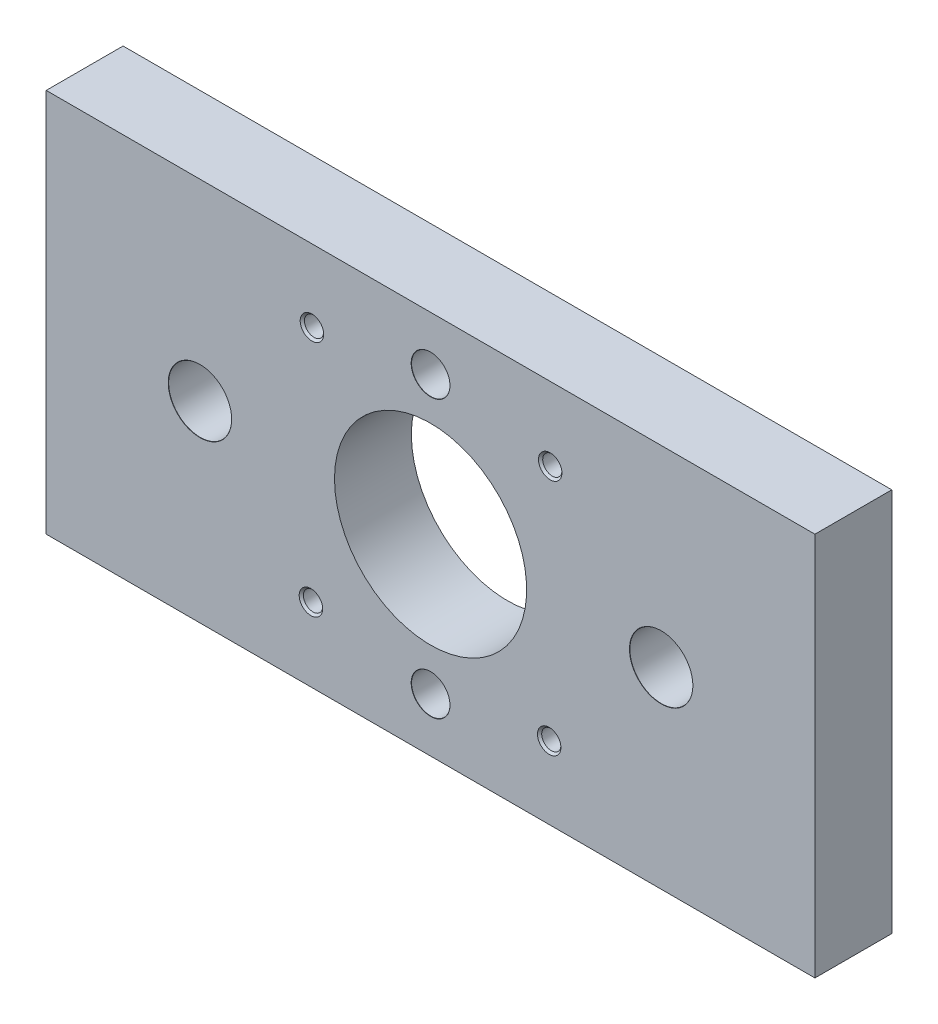
ISO-10303-21;
HEADER;
FILE_DESCRIPTION(('STEP AP214'),'2;1');
FILE_NAME('part.step','',(''),(''),'','','');
FILE_SCHEMA(('AUTOMOTIVE_DESIGN { 1 0 10303 214 1 1 1 1 }'));
ENDSEC;
DATA;
#1=APPLICATION_CONTEXT('core data for automotive mechanical design processes');
#2=APPLICATION_PROTOCOL_DEFINITION('international standard','automotive_design',2000,#1);
#3=PRODUCT_CONTEXT('',#1,'mechanical');
#4=PRODUCT('Part','Part','',(#3));
#5=PRODUCT_RELATED_PRODUCT_CATEGORY('part','',(#4));
#6=PRODUCT_DEFINITION_FORMATION('','',#4);
#7=PRODUCT_DEFINITION_CONTEXT('part definition',#1,'design');
#8=PRODUCT_DEFINITION('design','',#6,#7);
#9=PRODUCT_DEFINITION_SHAPE('','',#8);
#10=(LENGTH_UNIT() NAMED_UNIT(*) SI_UNIT(.MILLI.,.METRE.));
#11=(NAMED_UNIT(*) PLANE_ANGLE_UNIT() SI_UNIT($,.RADIAN.));
#12=(NAMED_UNIT(*) SI_UNIT($,.STERADIAN.) SOLID_ANGLE_UNIT());
#13=UNCERTAINTY_MEASURE_WITH_UNIT(LENGTH_MEASURE(1.E-05),#10,'distance_accuracy_value','');
#14=(GEOMETRIC_REPRESENTATION_CONTEXT(3) GLOBAL_UNCERTAINTY_ASSIGNED_CONTEXT((#13)) GLOBAL_UNIT_ASSIGNED_CONTEXT((#10,
#11,#12)) REPRESENTATION_CONTEXT('',''));
#15=CARTESIAN_POINT('',(0.,0.,0.));
#16=DIRECTION('',(0.,0.,1.));
#17=DIRECTION('',(1.,0.,0.));
#18=AXIS2_PLACEMENT_3D('',#15,#16,#17);
#19=CARTESIAN_POINT('',(0.,0.,10.));
#20=DIRECTION('',(0.,0.,-1.));
#21=DIRECTION('',(-1.,0.,0.));
#22=AXIS2_PLACEMENT_3D('',#19,#20,#21);
#23=PLANE('',#22);
#24=CARTESIAN_POINT('',(0.,0.,10.));
#25=DIRECTION('',(0.,0.,-1.));
#26=DIRECTION('',(-1.,0.,0.));
#27=AXIS2_PLACEMENT_3D('',#24,#25,#26);
#28=CIRCLE('',#27,12.5);
#29=CARTESIAN_POINT('',(-12.5,0.,10.));
#30=VERTEX_POINT('',#29);
#31=EDGE_CURVE('E237',#30,#30,#28,.T.);
#32=ORIENTED_EDGE('',*,*,#31,.T.);
#33=EDGE_LOOP('',(#32));
#34=FACE_BOUND('',#33,.T.);
#35=CARTESIAN_POINT('',(15.5656920969931,15.4340282992356,10.));
#36=DIRECTION('',(0.,0.,1.));
#37=DIRECTION('',(1.,0.,0.));
#38=AXIS2_PLACEMENT_3D('',#35,#36,#37);
#39=CIRCLE('',#38,1.525);
#40=CARTESIAN_POINT('',(17.0906920969931,15.4340282992356,10.));
#41=VERTEX_POINT('',#40);
#42=EDGE_CURVE('E233',#41,#41,#39,.T.);
#43=ORIENTED_EDGE('',*,*,#42,.F.);
#44=EDGE_LOOP('',(#43));
#45=FACE_BOUND('',#44,.T.);
#46=CARTESIAN_POINT('',(15.4340282992356,-15.5656920969931,10.));
#47=DIRECTION('',(0.,0.,1.));
#48=DIRECTION('',(1.,0.,0.));
#49=AXIS2_PLACEMENT_3D('',#46,#47,#48);
#50=CIRCLE('',#49,1.525);
#51=CARTESIAN_POINT('',(16.9590282992356,-15.5656920969931,10.));
#52=VERTEX_POINT('',#51);
#53=EDGE_CURVE('E221',#52,#52,#50,.T.);
#54=ORIENTED_EDGE('',*,*,#53,.F.);
#55=EDGE_LOOP('',(#54));
#56=FACE_BOUND('',#55,.T.);
#57=CARTESIAN_POINT('',(-15.5656920969931,-15.4340282992356,10.));
#58=DIRECTION('',(0.,0.,1.));
#59=DIRECTION('',(1.,0.,0.));
#60=AXIS2_PLACEMENT_3D('',#57,#58,#59);
#61=CIRCLE('',#60,1.525);
#62=CARTESIAN_POINT('',(-14.0406920969931,-15.4340282992356,10.));
#63=VERTEX_POINT('',#62);
#64=EDGE_CURVE('E209',#63,#63,#61,.T.);
#65=ORIENTED_EDGE('',*,*,#64,.F.);
#66=EDGE_LOOP('',(#65));
#67=FACE_BOUND('',#66,.T.);
#68=CARTESIAN_POINT('',(-15.4340282992356,15.5656920969931,10.));
#69=DIRECTION('',(0.,0.,1.));
#70=DIRECTION('',(1.,0.,0.));
#71=AXIS2_PLACEMENT_3D('',#68,#69,#70);
#72=CIRCLE('',#71,1.525);
#73=CARTESIAN_POINT('',(-13.9090282992356,15.5656920969931,10.));
#74=VERTEX_POINT('',#73);
#75=EDGE_CURVE('E197',#74,#74,#72,.T.);
#76=ORIENTED_EDGE('',*,*,#75,.F.);
#77=EDGE_LOOP('',(#76));
#78=FACE_BOUND('',#77,.T.);
#79=CARTESIAN_POINT('',(-30.,0.,10.));
#80=DIRECTION('',(0.,0.,1.));
#81=DIRECTION('',(1.,0.,0.));
#82=AXIS2_PLACEMENT_3D('',#79,#80,#81);
#83=CIRCLE('',#82,4.125);
#84=CARTESIAN_POINT('',(-25.875,0.,10.));
#85=VERTEX_POINT('',#84);
#86=EDGE_CURVE('E177',#85,#85,#83,.T.);
#87=ORIENTED_EDGE('',*,*,#86,.F.);
#88=EDGE_LOOP('',(#87));
#89=FACE_BOUND('',#88,.T.);
#90=CARTESIAN_POINT('',(30.,0.,10.));
#91=DIRECTION('',(0.,0.,1.));
#92=DIRECTION('',(1.,0.,0.));
#93=AXIS2_PLACEMENT_3D('',#90,#91,#92);
#94=CIRCLE('',#93,4.125);
#95=CARTESIAN_POINT('',(34.125,0.,10.));
#96=VERTEX_POINT('',#95);
#97=EDGE_CURVE('E161',#96,#96,#94,.T.);
#98=ORIENTED_EDGE('',*,*,#97,.F.);
#99=EDGE_LOOP('',(#98));
#100=FACE_BOUND('',#99,.T.);
#101=DIRECTION('',(0.,1.,0.));
#102=VECTOR('',#101,1.);
#103=CARTESIAN_POINT('',(50.,-25.,10.));
#104=LINE('',#103,#102);
#105=CARTESIAN_POINT('',(50.,-25.,10.));
#106=VERTEX_POINT('',#105);
#107=CARTESIAN_POINT('',(50.,25.,10.));
#108=VERTEX_POINT('',#107);
#109=EDGE_CURVE('E93',#106,#108,#104,.T.);
#110=ORIENTED_EDGE('',*,*,#109,.T.);
#111=DIRECTION('',(-1.,0.,0.));
#112=VECTOR('',#111,1.);
#113=CARTESIAN_POINT('',(-50.,25.,10.));
#114=LINE('',#113,#112);
#115=CARTESIAN_POINT('',(-50.,25.,10.));
#116=VERTEX_POINT('',#115);
#117=EDGE_CURVE('E88',#108,#116,#114,.T.);
#118=ORIENTED_EDGE('',*,*,#117,.T.);
#119=DIRECTION('',(0.,-1.,0.));
#120=VECTOR('',#119,1.);
#121=CARTESIAN_POINT('',(-50.,-25.,10.));
#122=LINE('',#121,#120);
#123=CARTESIAN_POINT('',(-50.,-25.,10.));
#124=VERTEX_POINT('',#123);
#125=EDGE_CURVE('E91',#116,#124,#122,.T.);
#126=ORIENTED_EDGE('',*,*,#125,.T.);
#127=DIRECTION('',(1.,0.,0.));
#128=VECTOR('',#127,1.);
#129=CARTESIAN_POINT('',(-50.,-25.,10.));
#130=LINE('',#129,#128);
#131=EDGE_CURVE('E58',#124,#106,#130,.T.);
#132=ORIENTED_EDGE('',*,*,#131,.T.);
#133=EDGE_LOOP('',(#110,#118,#126,#132));
#134=FACE_BOUND('',#133,.T.);
#135=CARTESIAN_POINT('',(0.,-18.,10.));
#136=DIRECTION('',(0.,0.,1.));
#137=DIRECTION('',(1.,0.,0.));
#138=AXIS2_PLACEMENT_3D('',#135,#136,#137);
#139=CIRCLE('',#138,2.525);
#140=CARTESIAN_POINT('',(2.525,-18.,10.));
#141=VERTEX_POINT('',#140);
#142=EDGE_CURVE('E137',#141,#141,#139,.T.);
#143=ORIENTED_EDGE('',*,*,#142,.F.);
#144=EDGE_LOOP('',(#143));
#145=FACE_BOUND('',#144,.T.);
#146=CARTESIAN_POINT('',(0.,18.,10.));
#147=DIRECTION('',(0.,0.,1.));
#148=DIRECTION('',(1.,0.,0.));
#149=AXIS2_PLACEMENT_3D('',#146,#147,#148);
#150=CIRCLE('',#149,2.525);
#151=CARTESIAN_POINT('',(2.525,18.,10.));
#152=VERTEX_POINT('',#151);
#153=EDGE_CURVE('E149',#152,#152,#150,.T.);
#154=ORIENTED_EDGE('',*,*,#153,.F.);
#155=EDGE_LOOP('',(#154));
#156=FACE_BOUND('',#155,.T.);
#157=ADVANCED_FACE('F40',(#34,#45,#56,#67,#78,#89,#100,#134,#145,#156),#23,.F.);
#158=CARTESIAN_POINT('',(50.,-25.,10.));
#159=DIRECTION('',(-1.,0.,0.));
#160=DIRECTION('',(0.,0.,1.));
#161=AXIS2_PLACEMENT_3D('',#158,#159,#160);
#162=PLANE('',#161);
#163=DIRECTION('',(0.,1.,0.));
#164=VECTOR('',#163,1.);
#165=CARTESIAN_POINT('',(50.,-25.,0.));
#166=LINE('',#165,#164);
#167=CARTESIAN_POINT('',(50.,-25.,0.));
#168=VERTEX_POINT('',#167);
#169=CARTESIAN_POINT('',(50.,25.,0.));
#170=VERTEX_POINT('',#169);
#171=EDGE_CURVE('E109',#168,#170,#166,.T.);
#172=ORIENTED_EDGE('',*,*,#171,.T.);
#173=DIRECTION('',(0.,0.,-1.));
#174=VECTOR('',#173,1.);
#175=CARTESIAN_POINT('',(50.,25.,10.));
#176=LINE('',#175,#174);
#177=EDGE_CURVE('E11',#108,#170,#176,.T.);
#178=ORIENTED_EDGE('',*,*,#177,.F.);
#179=ORIENTED_EDGE('',*,*,#109,.F.);
#180=DIRECTION('',(0.,0.,-1.));
#181=VECTOR('',#180,1.);
#182=CARTESIAN_POINT('',(50.,-25.,10.));
#183=LINE('',#182,#181);
#184=EDGE_CURVE('E105',#106,#168,#183,.T.);
#185=ORIENTED_EDGE('',*,*,#184,.T.);
#186=EDGE_LOOP('',(#172,#178,#179,#185));
#187=FACE_BOUND('',#186,.T.);
#188=ADVANCED_FACE('F42',(#187),#162,.F.);
#189=CARTESIAN_POINT('',(-50.,25.,10.));
#190=DIRECTION('',(0.,-1.,0.));
#191=DIRECTION('',(0.,0.,-1.));
#192=AXIS2_PLACEMENT_3D('',#189,#190,#191);
#193=PLANE('',#192);
#194=DIRECTION('',(-1.,0.,0.));
#195=VECTOR('',#194,1.);
#196=CARTESIAN_POINT('',(-50.,25.,0.));
#197=LINE('',#196,#195);
#198=CARTESIAN_POINT('',(-50.,25.,0.));
#199=VERTEX_POINT('',#198);
#200=EDGE_CURVE('E98',#170,#199,#197,.T.);
#201=ORIENTED_EDGE('',*,*,#200,.T.);
#202=DIRECTION('',(0.,0.,-1.));
#203=VECTOR('',#202,1.);
#204=CARTESIAN_POINT('',(-50.,25.,10.));
#205=LINE('',#204,#203);
#206=EDGE_CURVE('E50',#116,#199,#205,.T.);
#207=ORIENTED_EDGE('',*,*,#206,.F.);
#208=ORIENTED_EDGE('',*,*,#117,.F.);
#209=ORIENTED_EDGE('',*,*,#177,.T.);
#210=EDGE_LOOP('',(#201,#207,#208,#209));
#211=FACE_BOUND('',#210,.T.);
#212=ADVANCED_FACE('F97',(#211),#193,.F.);
#213=CARTESIAN_POINT('',(-50.,-25.,10.));
#214=DIRECTION('',(1.,0.,0.));
#215=DIRECTION('',(0.,0.,-1.));
#216=AXIS2_PLACEMENT_3D('',#213,#214,#215);
#217=PLANE('',#216);
#218=DIRECTION('',(0.,-1.,0.));
#219=VECTOR('',#218,1.);
#220=CARTESIAN_POINT('',(-50.,-25.,0.));
#221=LINE('',#220,#219);
#222=CARTESIAN_POINT('',(-50.,-25.,0.));
#223=VERTEX_POINT('',#222);
#224=EDGE_CURVE('E75',#199,#223,#221,.T.);
#225=ORIENTED_EDGE('',*,*,#224,.T.);
#226=DIRECTION('',(0.,0.,-1.));
#227=VECTOR('',#226,1.);
#228=CARTESIAN_POINT('',(-50.,-25.,10.));
#229=LINE('',#228,#227);
#230=EDGE_CURVE('E100',#124,#223,#229,.T.);
#231=ORIENTED_EDGE('',*,*,#230,.F.);
#232=ORIENTED_EDGE('',*,*,#125,.F.);
#233=ORIENTED_EDGE('',*,*,#206,.T.);
#234=EDGE_LOOP('',(#225,#231,#232,#233));
#235=FACE_BOUND('',#234,.T.);
#236=ADVANCED_FACE('F101',(#235),#217,.F.);
#237=CARTESIAN_POINT('',(-50.,-25.,10.));
#238=DIRECTION('',(0.,1.,0.));
#239=DIRECTION('',(0.,0.,1.));
#240=AXIS2_PLACEMENT_3D('',#237,#238,#239);
#241=PLANE('',#240);
#242=DIRECTION('',(1.,0.,0.));
#243=VECTOR('',#242,1.);
#244=CARTESIAN_POINT('',(-50.,-25.,0.));
#245=LINE('',#244,#243);
#246=EDGE_CURVE('E81',#223,#168,#245,.T.);
#247=ORIENTED_EDGE('',*,*,#246,.T.);
#248=ORIENTED_EDGE('',*,*,#184,.F.);
#249=ORIENTED_EDGE('',*,*,#131,.F.);
#250=ORIENTED_EDGE('',*,*,#230,.T.);
#251=EDGE_LOOP('',(#247,#248,#249,#250));
#252=FACE_BOUND('',#251,.T.);
#253=ADVANCED_FACE('F123',(#252),#241,.F.);
#254=CARTESIAN_POINT('',(0.,0.,0.));
#255=DIRECTION('',(0.,0.,-1.));
#256=DIRECTION('',(-1.,0.,0.));
#257=AXIS2_PLACEMENT_3D('',#254,#255,#256);
#258=PLANE('',#257);
#259=CARTESIAN_POINT('',(15.5656920969931,15.4340282992356,0.));
#260=DIRECTION('',(0.,0.,1.));
#261=DIRECTION('',(1.,0.,0.));
#262=AXIS2_PLACEMENT_3D('',#259,#260,#261);
#263=CIRCLE('',#262,1.25);
#264=CARTESIAN_POINT('',(16.8156920969931,15.4340282992356,0.));
#265=VERTEX_POINT('',#264);
#266=EDGE_CURVE('E225',#265,#265,#263,.T.);
#267=ORIENTED_EDGE('',*,*,#266,.T.);
#268=EDGE_LOOP('',(#267));
#269=FACE_BOUND('',#268,.T.);
#270=CARTESIAN_POINT('',(15.4340282992356,-15.5656920969931,0.));
#271=DIRECTION('',(0.,0.,1.));
#272=DIRECTION('',(1.,0.,0.));
#273=AXIS2_PLACEMENT_3D('',#270,#271,#272);
#274=CIRCLE('',#273,1.25);
#275=CARTESIAN_POINT('',(16.6840282992356,-15.5656920969931,0.));
#276=VERTEX_POINT('',#275);
#277=EDGE_CURVE('E213',#276,#276,#274,.T.);
#278=ORIENTED_EDGE('',*,*,#277,.T.);
#279=EDGE_LOOP('',(#278));
#280=FACE_BOUND('',#279,.T.);
#281=CARTESIAN_POINT('',(-15.5656920969931,-15.4340282992356,0.));
#282=DIRECTION('',(0.,0.,1.));
#283=DIRECTION('',(1.,0.,0.));
#284=AXIS2_PLACEMENT_3D('',#281,#282,#283);
#285=CIRCLE('',#284,1.25);
#286=CARTESIAN_POINT('',(-14.3156920969931,-15.4340282992356,0.));
#287=VERTEX_POINT('',#286);
#288=EDGE_CURVE('E201',#287,#287,#285,.T.);
#289=ORIENTED_EDGE('',*,*,#288,.T.);
#290=EDGE_LOOP('',(#289));
#291=FACE_BOUND('',#290,.T.);
#292=CARTESIAN_POINT('',(-15.4340282992356,15.5656920969931,0.));
#293=DIRECTION('',(0.,0.,1.));
#294=DIRECTION('',(1.,0.,0.));
#295=AXIS2_PLACEMENT_3D('',#292,#293,#294);
#296=CIRCLE('',#295,1.25);
#297=CARTESIAN_POINT('',(-14.1840282992356,15.5656920969931,0.));
#298=VERTEX_POINT('',#297);
#299=EDGE_CURVE('E189',#298,#298,#296,.T.);
#300=ORIENTED_EDGE('',*,*,#299,.T.);
#301=EDGE_LOOP('',(#300));
#302=FACE_BOUND('',#301,.T.);
#303=CARTESIAN_POINT('',(0.,0.,0.));
#304=DIRECTION('',(0.,0.,-1.));
#305=DIRECTION('',(-1.,0.,0.));
#306=AXIS2_PLACEMENT_3D('',#303,#304,#305);
#307=CIRCLE('',#306,12.5);
#308=CARTESIAN_POINT('',(-12.5,0.,0.));
#309=VERTEX_POINT('',#308);
#310=EDGE_CURVE('E185',#309,#309,#307,.T.);
#311=ORIENTED_EDGE('',*,*,#310,.F.);
#312=EDGE_LOOP('',(#311));
#313=FACE_BOUND('',#312,.T.);
#314=CARTESIAN_POINT('',(-30.,0.,0.));
#315=DIRECTION('',(0.,0.,1.));
#316=DIRECTION('',(1.,0.,0.));
#317=AXIS2_PLACEMENT_3D('',#314,#315,#316);
#318=CIRCLE('',#317,4.125);
#319=CARTESIAN_POINT('',(-25.875,0.,0.));
#320=VERTEX_POINT('',#319);
#321=EDGE_CURVE('E181',#320,#320,#318,.T.);
#322=ORIENTED_EDGE('',*,*,#321,.T.);
#323=EDGE_LOOP('',(#322));
#324=FACE_BOUND('',#323,.T.);
#325=CARTESIAN_POINT('',(30.,0.,0.));
#326=DIRECTION('',(0.,0.,1.));
#327=DIRECTION('',(1.,0.,0.));
#328=AXIS2_PLACEMENT_3D('',#325,#326,#327);
#329=CIRCLE('',#328,4.125);
#330=CARTESIAN_POINT('',(34.125,0.,0.));
#331=VERTEX_POINT('',#330);
#332=EDGE_CURVE('E165',#331,#331,#329,.T.);
#333=ORIENTED_EDGE('',*,*,#332,.T.);
#334=EDGE_LOOP('',(#333));
#335=FACE_BOUND('',#334,.T.);
#336=CARTESIAN_POINT('',(0.,18.,0.));
#337=DIRECTION('',(0.,0.,-1.));
#338=DIRECTION('',(-1.,0.,0.));
#339=AXIS2_PLACEMENT_3D('',#336,#337,#338);
#340=CIRCLE('',#339,2.5);
#341=CARTESIAN_POINT('',(-2.5,18.,0.));
#342=VERTEX_POINT('',#341);
#343=EDGE_CURVE('E141',#342,#342,#340,.T.);
#344=ORIENTED_EDGE('',*,*,#343,.F.);
#345=EDGE_LOOP('',(#344));
#346=FACE_BOUND('',#345,.T.);
#347=CARTESIAN_POINT('',(0.,-18.,0.));
#348=DIRECTION('',(0.,0.,-1.));
#349=DIRECTION('',(-1.,0.,0.));
#350=AXIS2_PLACEMENT_3D('',#347,#348,#349);
#351=CIRCLE('',#350,2.5);
#352=CARTESIAN_POINT('',(-2.5,-18.,0.));
#353=VERTEX_POINT('',#352);
#354=EDGE_CURVE('E113',#353,#353,#351,.T.);
#355=ORIENTED_EDGE('',*,*,#354,.F.);
#356=EDGE_LOOP('',(#355));
#357=FACE_BOUND('',#356,.T.);
#358=ORIENTED_EDGE('',*,*,#171,.F.);
#359=ORIENTED_EDGE('',*,*,#246,.F.);
#360=ORIENTED_EDGE('',*,*,#224,.F.);
#361=ORIENTED_EDGE('',*,*,#200,.F.);
#362=EDGE_LOOP('',(#358,#359,#360,#361));
#363=FACE_BOUND('',#362,.T.);
#364=ADVANCED_FACE('F126',(#269,#280,#291,#302,#313,#324,#335,#346,#357,#363),#258,.T.);
#365=CARTESIAN_POINT('',(0.,-18.,10.));
#366=DIRECTION('',(0.,0.,1.));
#367=DIRECTION('',(1.,0.,0.));
#368=AXIS2_PLACEMENT_3D('',#365,#366,#367);
#369=CYLINDRICAL_SURFACE('',#368,2.5);
#370=CARTESIAN_POINT('',(0.,-18.,9.975));
#371=DIRECTION('',(0.,0.,1.));
#372=DIRECTION('',(1.,0.,0.));
#373=AXIS2_PLACEMENT_3D('',#370,#371,#372);
#374=CIRCLE('',#373,2.5);
#375=CARTESIAN_POINT('',(2.5,-18.,9.975));
#376=VERTEX_POINT('',#375);
#377=EDGE_CURVE('E133',#376,#376,#374,.T.);
#378=ORIENTED_EDGE('',*,*,#377,.T.);
#379=EDGE_LOOP('',(#378));
#380=FACE_BOUND('',#379,.T.);
#381=ORIENTED_EDGE('',*,*,#354,.T.);
#382=EDGE_LOOP('',(#381));
#383=FACE_BOUND('',#382,.T.);
#384=ADVANCED_FACE('F267',(#380,#383),#369,.F.);
#385=CARTESIAN_POINT('',(0.,-18.,10.));
#386=DIRECTION('',(0.,0.,1.));
#387=DIRECTION('',(1.,0.,0.));
#388=AXIS2_PLACEMENT_3D('',#385,#386,#387);
#389=CONICAL_SURFACE('',#388,2.525,0.785398163397483);
#390=ORIENTED_EDGE('',*,*,#377,.F.);
#391=EDGE_LOOP('',(#390));
#392=FACE_BOUND('',#391,.T.);
#393=ORIENTED_EDGE('',*,*,#142,.T.);
#394=EDGE_LOOP('',(#393));
#395=FACE_BOUND('',#394,.T.);
#396=ADVANCED_FACE('F300',(#392,#395),#389,.F.);
#397=CARTESIAN_POINT('',(0.,18.,10.));
#398=DIRECTION('',(0.,0.,1.));
#399=DIRECTION('',(1.,0.,0.));
#400=AXIS2_PLACEMENT_3D('',#397,#398,#399);
#401=CYLINDRICAL_SURFACE('',#400,2.5);
#402=CARTESIAN_POINT('',(0.,18.,9.975));
#403=DIRECTION('',(0.,0.,1.));
#404=DIRECTION('',(1.,0.,0.));
#405=AXIS2_PLACEMENT_3D('',#402,#403,#404);
#406=CIRCLE('',#405,2.5);
#407=CARTESIAN_POINT('',(2.5,18.,9.975));
#408=VERTEX_POINT('',#407);
#409=EDGE_CURVE('E145',#408,#408,#406,.T.);
#410=ORIENTED_EDGE('',*,*,#409,.T.);
#411=EDGE_LOOP('',(#410));
#412=FACE_BOUND('',#411,.T.);
#413=ORIENTED_EDGE('',*,*,#343,.T.);
#414=EDGE_LOOP('',(#413));
#415=FACE_BOUND('',#414,.T.);
#416=ADVANCED_FACE('F307',(#412,#415),#401,.F.);
#417=CARTESIAN_POINT('',(0.,18.,10.));
#418=DIRECTION('',(0.,0.,1.));
#419=DIRECTION('',(1.,0.,0.));
#420=AXIS2_PLACEMENT_3D('',#417,#418,#419);
#421=CONICAL_SURFACE('',#420,2.525,0.785398163397483);
#422=ORIENTED_EDGE('',*,*,#409,.F.);
#423=EDGE_LOOP('',(#422));
#424=FACE_BOUND('',#423,.T.);
#425=ORIENTED_EDGE('',*,*,#153,.T.);
#426=EDGE_LOOP('',(#425));
#427=FACE_BOUND('',#426,.T.);
#428=ADVANCED_FACE('F314',(#424,#427),#421,.F.);
#429=CARTESIAN_POINT('',(30.,0.,0.0250000000000025));
#430=DIRECTION('',(0.,0.,-1.));
#431=DIRECTION('',(-1.,0.,0.));
#432=AXIS2_PLACEMENT_3D('',#429,#430,#431);
#433=CONICAL_SURFACE('',#432,4.1,0.785398163397379);
#434=ORIENTED_EDGE('',*,*,#332,.F.);
#435=EDGE_LOOP('',(#434));
#436=FACE_BOUND('',#435,.T.);
#437=CARTESIAN_POINT('',(30.,0.,0.0250000000000025));
#438=DIRECTION('',(0.,0.,1.));
#439=DIRECTION('',(1.,0.,0.));
#440=AXIS2_PLACEMENT_3D('',#437,#438,#439);
#441=CIRCLE('',#440,4.1);
#442=CARTESIAN_POINT('',(34.1,0.,0.0250000000000025));
#443=VERTEX_POINT('',#442);
#444=EDGE_CURVE('E153',#443,#443,#441,.T.);
#445=ORIENTED_EDGE('',*,*,#444,.T.);
#446=EDGE_LOOP('',(#445));
#447=FACE_BOUND('',#446,.T.);
#448=ADVANCED_FACE('F322',(#436,#447),#433,.F.);
#449=CARTESIAN_POINT('',(30.,0.,10.));
#450=DIRECTION('',(0.,0.,1.));
#451=DIRECTION('',(1.,0.,0.));
#452=AXIS2_PLACEMENT_3D('',#449,#450,#451);
#453=CYLINDRICAL_SURFACE('',#452,4.1);
#454=ORIENTED_EDGE('',*,*,#444,.F.);
#455=EDGE_LOOP('',(#454));
#456=FACE_BOUND('',#455,.T.);
#457=CARTESIAN_POINT('',(30.,0.,9.975));
#458=DIRECTION('',(0.,0.,1.));
#459=DIRECTION('',(1.,0.,0.));
#460=AXIS2_PLACEMENT_3D('',#457,#458,#459);
#461=CIRCLE('',#460,4.1);
#462=CARTESIAN_POINT('',(34.1,0.,9.975));
#463=VERTEX_POINT('',#462);
#464=EDGE_CURVE('E157',#463,#463,#461,.T.);
#465=ORIENTED_EDGE('',*,*,#464,.T.);
#466=EDGE_LOOP('',(#465));
#467=FACE_BOUND('',#466,.T.);
#468=ADVANCED_FACE('F330',(#456,#467),#453,.F.);
#469=CARTESIAN_POINT('',(30.,0.,10.));
#470=DIRECTION('',(0.,0.,1.));
#471=DIRECTION('',(1.,0.,0.));
#472=AXIS2_PLACEMENT_3D('',#469,#470,#471);
#473=CONICAL_SURFACE('',#472,4.125,0.785398163397518);
#474=ORIENTED_EDGE('',*,*,#464,.F.);
#475=EDGE_LOOP('',(#474));
#476=FACE_BOUND('',#475,.T.);
#477=ORIENTED_EDGE('',*,*,#97,.T.);
#478=EDGE_LOOP('',(#477));
#479=FACE_BOUND('',#478,.T.);
#480=ADVANCED_FACE('F338',(#476,#479),#473,.F.);
#481=CARTESIAN_POINT('',(-30.,0.,0.0250000000000025));
#482=DIRECTION('',(0.,0.,-1.));
#483=DIRECTION('',(-1.,0.,0.));
#484=AXIS2_PLACEMENT_3D('',#481,#482,#483);
#485=CONICAL_SURFACE('',#484,4.1,0.785398163397379);
#486=ORIENTED_EDGE('',*,*,#321,.F.);
#487=EDGE_LOOP('',(#486));
#488=FACE_BOUND('',#487,.T.);
#489=CARTESIAN_POINT('',(-30.,0.,0.0250000000000025));
#490=DIRECTION('',(0.,0.,1.));
#491=DIRECTION('',(1.,0.,0.));
#492=AXIS2_PLACEMENT_3D('',#489,#490,#491);
#493=CIRCLE('',#492,4.1);
#494=CARTESIAN_POINT('',(-25.9,0.,0.0250000000000025));
#495=VERTEX_POINT('',#494);
#496=EDGE_CURVE('E169',#495,#495,#493,.T.);
#497=ORIENTED_EDGE('',*,*,#496,.T.);
#498=EDGE_LOOP('',(#497));
#499=FACE_BOUND('',#498,.T.);
#500=ADVANCED_FACE('F346',(#488,#499),#485,.F.);
#501=CARTESIAN_POINT('',(-30.,0.,10.));
#502=DIRECTION('',(0.,0.,1.));
#503=DIRECTION('',(1.,0.,0.));
#504=AXIS2_PLACEMENT_3D('',#501,#502,#503);
#505=CYLINDRICAL_SURFACE('',#504,4.1);
#506=ORIENTED_EDGE('',*,*,#496,.F.);
#507=EDGE_LOOP('',(#506));
#508=FACE_BOUND('',#507,.T.);
#509=CARTESIAN_POINT('',(-30.,0.,9.975));
#510=DIRECTION('',(0.,0.,1.));
#511=DIRECTION('',(1.,0.,0.));
#512=AXIS2_PLACEMENT_3D('',#509,#510,#511);
#513=CIRCLE('',#512,4.1);
#514=CARTESIAN_POINT('',(-25.9,0.,9.975));
#515=VERTEX_POINT('',#514);
#516=EDGE_CURVE('E173',#515,#515,#513,.T.);
#517=ORIENTED_EDGE('',*,*,#516,.T.);
#518=EDGE_LOOP('',(#517));
#519=FACE_BOUND('',#518,.T.);
#520=ADVANCED_FACE('F257',(#508,#519),#505,.F.);
#521=CARTESIAN_POINT('',(-30.,0.,10.));
#522=DIRECTION('',(0.,0.,1.));
#523=DIRECTION('',(1.,0.,0.));
#524=AXIS2_PLACEMENT_3D('',#521,#522,#523);
#525=CONICAL_SURFACE('',#524,4.125,0.785398163397448);
#526=ORIENTED_EDGE('',*,*,#516,.F.);
#527=EDGE_LOOP('',(#526));
#528=FACE_BOUND('',#527,.T.);
#529=ORIENTED_EDGE('',*,*,#86,.T.);
#530=EDGE_LOOP('',(#529));
#531=FACE_BOUND('',#530,.T.);
#532=ADVANCED_FACE('F247',(#528,#531),#525,.F.);
#533=CARTESIAN_POINT('',(0.,0.,2.5));
#534=DIRECTION('',(0.,0.,-1.));
#535=DIRECTION('',(-1.,0.,0.));
#536=AXIS2_PLACEMENT_3D('',#533,#534,#535);
#537=CYLINDRICAL_SURFACE('',#536,12.5);
#538=ORIENTED_EDGE('',*,*,#310,.T.);
#539=EDGE_LOOP('',(#538));
#540=FACE_BOUND('',#539,.T.);
#541=ORIENTED_EDGE('',*,*,#31,.F.);
#542=EDGE_LOOP('',(#541));
#543=FACE_BOUND('',#542,.T.);
#544=ADVANCED_FACE('F244',(#540,#543),#537,.F.);
#545=CARTESIAN_POINT('',(-15.4340282992356,15.5656920969931,10.));
#546=DIRECTION('',(0.,0.,1.));
#547=DIRECTION('',(1.,0.,0.));
#548=AXIS2_PLACEMENT_3D('',#545,#546,#547);
#549=CYLINDRICAL_SURFACE('',#548,1.25);
#550=ORIENTED_EDGE('',*,*,#299,.F.);
#551=EDGE_LOOP('',(#550));
#552=FACE_BOUND('',#551,.T.);
#553=CARTESIAN_POINT('',(-15.4340282992356,15.5656920969931,9.725));
#554=DIRECTION('',(0.,0.,1.));
#555=DIRECTION('',(1.,0.,0.));
#556=AXIS2_PLACEMENT_3D('',#553,#554,#555);
#557=CIRCLE('',#556,1.25);
#558=CARTESIAN_POINT('',(-14.1840282992356,15.5656920969931,9.725));
#559=VERTEX_POINT('',#558);
#560=EDGE_CURVE('E193',#559,#559,#557,.T.);
#561=ORIENTED_EDGE('',*,*,#560,.T.);
#562=EDGE_LOOP('',(#561));
#563=FACE_BOUND('',#562,.T.);
#564=ADVANCED_FACE('F246',(#552,#563),#549,.F.);
#565=CARTESIAN_POINT('',(-15.4340282992356,15.5656920969931,10.));
#566=DIRECTION('',(0.,0.,1.));
#567=DIRECTION('',(1.,0.,0.));
#568=AXIS2_PLACEMENT_3D('',#565,#566,#567);
#569=CONICAL_SURFACE('',#568,1.525,0.785398163397448);
#570=ORIENTED_EDGE('',*,*,#560,.F.);
#571=EDGE_LOOP('',(#570));
#572=FACE_BOUND('',#571,.T.);
#573=ORIENTED_EDGE('',*,*,#75,.T.);
#574=EDGE_LOOP('',(#573));
#575=FACE_BOUND('',#574,.T.);
#576=ADVANCED_FACE('F254',(#572,#575),#569,.F.);
#577=CARTESIAN_POINT('',(-15.5656920969931,-15.4340282992356,10.));
#578=DIRECTION('',(0.,0.,1.));
#579=DIRECTION('',(1.,0.,0.));
#580=AXIS2_PLACEMENT_3D('',#577,#578,#579);
#581=CYLINDRICAL_SURFACE('',#580,1.25);
#582=ORIENTED_EDGE('',*,*,#288,.F.);
#583=EDGE_LOOP('',(#582));
#584=FACE_BOUND('',#583,.T.);
#585=CARTESIAN_POINT('',(-15.5656920969931,-15.4340282992356,9.725));
#586=DIRECTION('',(0.,0.,1.));
#587=DIRECTION('',(1.,0.,0.));
#588=AXIS2_PLACEMENT_3D('',#585,#586,#587);
#589=CIRCLE('',#588,1.25);
#590=CARTESIAN_POINT('',(-14.3156920969931,-15.4340282992356,9.725));
#591=VERTEX_POINT('',#590);
#592=EDGE_CURVE('E205',#591,#591,#589,.T.);
#593=ORIENTED_EDGE('',*,*,#592,.T.);
#594=EDGE_LOOP('',(#593));
#595=FACE_BOUND('',#594,.T.);
#596=ADVANCED_FACE('F389',(#584,#595),#581,.F.);
#597=CARTESIAN_POINT('',(-15.5656920969931,-15.4340282992356,10.));
#598=DIRECTION('',(0.,0.,1.));
#599=DIRECTION('',(1.,0.,0.));
#600=AXIS2_PLACEMENT_3D('',#597,#598,#599);
#601=CONICAL_SURFACE('',#600,1.525,0.785398163397448);
#602=ORIENTED_EDGE('',*,*,#592,.F.);
#603=EDGE_LOOP('',(#602));
#604=FACE_BOUND('',#603,.T.);
#605=ORIENTED_EDGE('',*,*,#64,.T.);
#606=EDGE_LOOP('',(#605));
#607=FACE_BOUND('',#606,.T.);
#608=ADVANCED_FACE('F398',(#604,#607),#601,.F.);
#609=CARTESIAN_POINT('',(15.4340282992356,-15.5656920969931,10.));
#610=DIRECTION('',(0.,0.,1.));
#611=DIRECTION('',(1.,0.,0.));
#612=AXIS2_PLACEMENT_3D('',#609,#610,#611);
#613=CYLINDRICAL_SURFACE('',#612,1.25);
#614=ORIENTED_EDGE('',*,*,#277,.F.);
#615=EDGE_LOOP('',(#614));
#616=FACE_BOUND('',#615,.T.);
#617=CARTESIAN_POINT('',(15.4340282992356,-15.5656920969931,9.725));
#618=DIRECTION('',(0.,0.,1.));
#619=DIRECTION('',(1.,0.,0.));
#620=AXIS2_PLACEMENT_3D('',#617,#618,#619);
#621=CIRCLE('',#620,1.25);
#622=CARTESIAN_POINT('',(16.6840282992356,-15.5656920969931,9.725));
#623=VERTEX_POINT('',#622);
#624=EDGE_CURVE('E217',#623,#623,#621,.T.);
#625=ORIENTED_EDGE('',*,*,#624,.T.);
#626=EDGE_LOOP('',(#625));
#627=FACE_BOUND('',#626,.T.);
#628=ADVANCED_FACE('F408',(#616,#627),#613,.F.);
#629=CARTESIAN_POINT('',(15.4340282992356,-15.5656920969931,10.));
#630=DIRECTION('',(0.,0.,1.));
#631=DIRECTION('',(1.,0.,0.));
#632=AXIS2_PLACEMENT_3D('',#629,#630,#631);
#633=CONICAL_SURFACE('',#632,1.525,0.785398163397448);
#634=ORIENTED_EDGE('',*,*,#624,.F.);
#635=EDGE_LOOP('',(#634));
#636=FACE_BOUND('',#635,.T.);
#637=ORIENTED_EDGE('',*,*,#53,.T.);
#638=EDGE_LOOP('',(#637));
#639=FACE_BOUND('',#638,.T.);
#640=ADVANCED_FACE('F417',(#636,#639),#633,.F.);
#641=CARTESIAN_POINT('',(15.5656920969931,15.4340282992356,10.));
#642=DIRECTION('',(0.,0.,1.));
#643=DIRECTION('',(1.,0.,0.));
#644=AXIS2_PLACEMENT_3D('',#641,#642,#643);
#645=CYLINDRICAL_SURFACE('',#644,1.25);
#646=ORIENTED_EDGE('',*,*,#266,.F.);
#647=EDGE_LOOP('',(#646));
#648=FACE_BOUND('',#647,.T.);
#649=CARTESIAN_POINT('',(15.5656920969931,15.4340282992356,9.725));
#650=DIRECTION('',(0.,0.,1.));
#651=DIRECTION('',(1.,0.,0.));
#652=AXIS2_PLACEMENT_3D('',#649,#650,#651);
#653=CIRCLE('',#652,1.25);
#654=CARTESIAN_POINT('',(16.8156920969931,15.4340282992356,9.725));
#655=VERTEX_POINT('',#654);
#656=EDGE_CURVE('E229',#655,#655,#653,.T.);
#657=ORIENTED_EDGE('',*,*,#656,.T.);
#658=EDGE_LOOP('',(#657));
#659=FACE_BOUND('',#658,.T.);
#660=ADVANCED_FACE('F427',(#648,#659),#645,.F.);
#661=CARTESIAN_POINT('',(15.5656920969931,15.4340282992356,10.));
#662=DIRECTION('',(0.,0.,1.));
#663=DIRECTION('',(1.,0.,0.));
#664=AXIS2_PLACEMENT_3D('',#661,#662,#663);
#665=CONICAL_SURFACE('',#664,1.525,0.785398163397448);
#666=ORIENTED_EDGE('',*,*,#656,.F.);
#667=EDGE_LOOP('',(#666));
#668=FACE_BOUND('',#667,.T.);
#669=ORIENTED_EDGE('',*,*,#42,.T.);
#670=EDGE_LOOP('',(#669));
#671=FACE_BOUND('',#670,.T.);
#672=ADVANCED_FACE('F435',(#668,#671),#665,.F.);
#673=CLOSED_SHELL('',(#157,#188,#212,#236,#253,#364,#384,#396,#416,#428,#448,#468,#480,#500,
#520,#532,#544,#564,#576,#596,#608,#628,#640,#660,#672));
#674=MANIFOLD_SOLID_BREP('B2',#673);
#675=ADVANCED_BREP_SHAPE_REPRESENTATION('',(#18,#674),#14);
#676=SHAPE_DEFINITION_REPRESENTATION(#9,#675);
ENDSEC;
END-ISO-10303-21;
